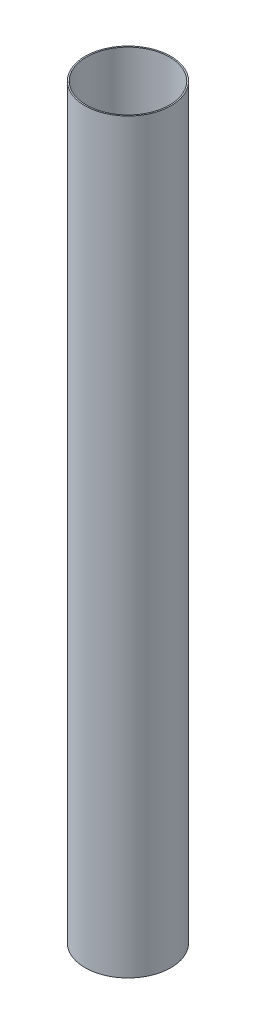
ISO-10303-21;
HEADER;
FILE_DESCRIPTION(('STEP AP214'),'2;1');
FILE_NAME('part.step','',(''),(''),'','','');
FILE_SCHEMA(('AUTOMOTIVE_DESIGN { 1 0 10303 214 1 1 1 1 }'));
ENDSEC;
DATA;
#1=APPLICATION_CONTEXT('core data for automotive mechanical design processes');
#2=APPLICATION_PROTOCOL_DEFINITION('international standard','automotive_design',2000,#1);
#3=PRODUCT_CONTEXT('',#1,'mechanical');
#4=PRODUCT('Part','Part','',(#3));
#5=PRODUCT_RELATED_PRODUCT_CATEGORY('part','',(#4));
#6=PRODUCT_DEFINITION_FORMATION('','',#4);
#7=PRODUCT_DEFINITION_CONTEXT('part definition',#1,'design');
#8=PRODUCT_DEFINITION('design','',#6,#7);
#9=PRODUCT_DEFINITION_SHAPE('','',#8);
#10=(LENGTH_UNIT() NAMED_UNIT(*) SI_UNIT(.MILLI.,.METRE.));
#11=(NAMED_UNIT(*) PLANE_ANGLE_UNIT() SI_UNIT($,.RADIAN.));
#12=(NAMED_UNIT(*) SI_UNIT($,.STERADIAN.) SOLID_ANGLE_UNIT());
#13=UNCERTAINTY_MEASURE_WITH_UNIT(LENGTH_MEASURE(1.E-05),#10,'distance_accuracy_value','');
#14=(GEOMETRIC_REPRESENTATION_CONTEXT(3) GLOBAL_UNCERTAINTY_ASSIGNED_CONTEXT((#13)) GLOBAL_UNIT_ASSIGNED_CONTEXT((#10,
#11,#12)) REPRESENTATION_CONTEXT('',''));
#15=CARTESIAN_POINT('',(0.,0.,0.));
#16=DIRECTION('',(0.,0.,1.));
#17=DIRECTION('',(1.,0.,0.));
#18=AXIS2_PLACEMENT_3D('',#15,#16,#17);
#19=CARTESIAN_POINT('',(0.,889.,0.));
#20=DIRECTION('',(0.,1.,0.));
#21=DIRECTION('',(0.,0.,1.));
#22=AXIS2_PLACEMENT_3D('',#19,#20,#21);
#23=PLANE('',#22);
#24=CARTESIAN_POINT('',(0.,889.,0.));
#25=DIRECTION('',(0.,1.,0.));
#26=DIRECTION('',(0.,0.,1.));
#27=AXIS2_PLACEMENT_3D('',#24,#25,#26);
#28=CIRCLE('',#27,51.1048);
#29=CARTESIAN_POINT('',(0.,889.,51.1048));
#30=VERTEX_POINT('',#29);
#31=EDGE_CURVE('E10',#30,#30,#28,.T.);
#32=ORIENTED_EDGE('',*,*,#31,.T.);
#33=EDGE_LOOP('',(#32));
#34=FACE_BOUND('',#33,.T.);
#35=CARTESIAN_POINT('',(0.,889.,0.));
#36=DIRECTION('',(0.,1.,0.));
#37=DIRECTION('',(0.,0.,1.));
#38=AXIS2_PLACEMENT_3D('',#35,#36,#37);
#39=CIRCLE('',#38,49.53);
#40=CARTESIAN_POINT('',(0.,889.,49.53));
#41=VERTEX_POINT('',#40);
#42=EDGE_CURVE('E50',#41,#41,#39,.T.);
#43=ORIENTED_EDGE('',*,*,#42,.F.);
#44=EDGE_LOOP('',(#43));
#45=FACE_BOUND('',#44,.T.);
#46=ADVANCED_FACE('F39',(#34,#45),#23,.T.);
#47=CARTESIAN_POINT('',(0.,0.,0.));
#48=DIRECTION('',(0.,1.,0.));
#49=DIRECTION('',(0.,0.,1.));
#50=AXIS2_PLACEMENT_3D('',#47,#48,#49);
#51=PLANE('',#50);
#52=CARTESIAN_POINT('',(0.,0.,0.));
#53=DIRECTION('',(0.,1.,0.));
#54=DIRECTION('',(0.,0.,1.));
#55=AXIS2_PLACEMENT_3D('',#52,#53,#54);
#56=CIRCLE('',#55,51.1048);
#57=CARTESIAN_POINT('',(0.,0.,51.1048));
#58=VERTEX_POINT('',#57);
#59=EDGE_CURVE('E43',#58,#58,#56,.T.);
#60=ORIENTED_EDGE('',*,*,#59,.F.);
#61=EDGE_LOOP('',(#60));
#62=FACE_BOUND('',#61,.T.);
#63=CARTESIAN_POINT('',(0.,0.,0.));
#64=DIRECTION('',(0.,1.,0.));
#65=DIRECTION('',(0.,0.,1.));
#66=AXIS2_PLACEMENT_3D('',#63,#64,#65);
#67=CIRCLE('',#66,49.53);
#68=CARTESIAN_POINT('',(0.,0.,49.53));
#69=VERTEX_POINT('',#68);
#70=EDGE_CURVE('E52',#69,#69,#67,.T.);
#71=ORIENTED_EDGE('',*,*,#70,.T.);
#72=EDGE_LOOP('',(#71));
#73=FACE_BOUND('',#72,.T.);
#74=ADVANCED_FACE('F62',(#62,#73),#51,.F.);
#75=CARTESIAN_POINT('',(0.,889.,0.));
#76=DIRECTION('',(0.,-1.,0.));
#77=DIRECTION('',(0.,0.,-1.));
#78=AXIS2_PLACEMENT_3D('',#75,#76,#77);
#79=CYLINDRICAL_SURFACE('',#78,51.1048);
#80=ORIENTED_EDGE('',*,*,#31,.F.);
#81=EDGE_LOOP('',(#80));
#82=FACE_BOUND('',#81,.T.);
#83=ORIENTED_EDGE('',*,*,#59,.T.);
#84=EDGE_LOOP('',(#83));
#85=FACE_BOUND('',#84,.T.);
#86=ADVANCED_FACE('F41',(#82,#85),#79,.T.);
#87=CARTESIAN_POINT('',(0.,889.,0.));
#88=DIRECTION('',(0.,-1.,0.));
#89=DIRECTION('',(0.,0.,-1.));
#90=AXIS2_PLACEMENT_3D('',#87,#88,#89);
#91=CYLINDRICAL_SURFACE('',#90,49.53);
#92=ORIENTED_EDGE('',*,*,#42,.T.);
#93=EDGE_LOOP('',(#92));
#94=FACE_BOUND('',#93,.T.);
#95=ORIENTED_EDGE('',*,*,#70,.F.);
#96=EDGE_LOOP('',(#95));
#97=FACE_BOUND('',#96,.T.);
#98=ADVANCED_FACE('F58',(#94,#97),#91,.F.);
#99=CLOSED_SHELL('',(#46,#74,#86,#98));
#100=MANIFOLD_SOLID_BREP('B2',#99);
#101=ADVANCED_BREP_SHAPE_REPRESENTATION('',(#18,#100),#14);
#102=SHAPE_DEFINITION_REPRESENTATION(#9,#101);
ENDSEC;
END-ISO-10303-21;
